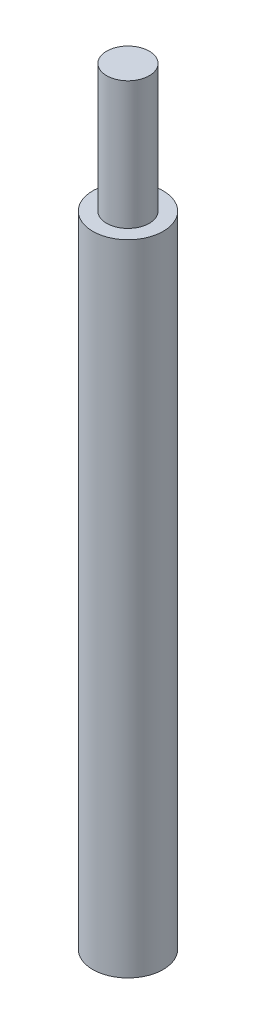
ISO-10303-21;
HEADER;
FILE_DESCRIPTION(('STEP AP214'),'2;1');
FILE_NAME('part.step','',(''),(''),'','','');
FILE_SCHEMA(('AUTOMOTIVE_DESIGN { 1 0 10303 214 1 1 1 1 }'));
ENDSEC;
DATA;
#1=APPLICATION_CONTEXT('core data for automotive mechanical design processes');
#2=APPLICATION_PROTOCOL_DEFINITION('international standard','automotive_design',2000,#1);
#3=PRODUCT_CONTEXT('',#1,'mechanical');
#4=PRODUCT('Part','Part','',(#3));
#5=PRODUCT_RELATED_PRODUCT_CATEGORY('part','',(#4));
#6=PRODUCT_DEFINITION_FORMATION('','',#4);
#7=PRODUCT_DEFINITION_CONTEXT('part definition',#1,'design');
#8=PRODUCT_DEFINITION('design','',#6,#7);
#9=PRODUCT_DEFINITION_SHAPE('','',#8);
#10=(LENGTH_UNIT() NAMED_UNIT(*) SI_UNIT(.MILLI.,.METRE.));
#11=(NAMED_UNIT(*) PLANE_ANGLE_UNIT() SI_UNIT($,.RADIAN.));
#12=(NAMED_UNIT(*) SI_UNIT($,.STERADIAN.) SOLID_ANGLE_UNIT());
#13=UNCERTAINTY_MEASURE_WITH_UNIT(LENGTH_MEASURE(1.E-05),#10,'distance_accuracy_value','');
#14=(GEOMETRIC_REPRESENTATION_CONTEXT(3) GLOBAL_UNCERTAINTY_ASSIGNED_CONTEXT((#13)) GLOBAL_UNIT_ASSIGNED_CONTEXT((#10,
#11,#12)) REPRESENTATION_CONTEXT('',''));
#15=CARTESIAN_POINT('',(0.,0.,0.));
#16=DIRECTION('',(0.,0.,1.));
#17=DIRECTION('',(1.,0.,0.));
#18=AXIS2_PLACEMENT_3D('',#15,#16,#17);
#19=CARTESIAN_POINT('',(0.,30.,0.));
#20=DIRECTION('',(0.,-1.,0.));
#21=DIRECTION('',(0.,0.,-1.));
#22=AXIS2_PLACEMENT_3D('',#19,#20,#21);
#23=CYLINDRICAL_SURFACE('',#22,1.65);
#24=CARTESIAN_POINT('',(0.,30.,0.));
#25=DIRECTION('',(0.,1.,0.));
#26=DIRECTION('',(0.,0.,1.));
#27=AXIS2_PLACEMENT_3D('',#24,#25,#26);
#28=CIRCLE('',#27,1.65);
#29=CARTESIAN_POINT('',(0.,30.,1.65));
#30=VERTEX_POINT('',#29);
#31=EDGE_CURVE('E38',#30,#30,#28,.T.);
#32=ORIENTED_EDGE('',*,*,#31,.F.);
#33=EDGE_LOOP('',(#32));
#34=FACE_BOUND('',#33,.T.);
#35=CARTESIAN_POINT('',(0.,0.,0.));
#36=DIRECTION('',(0.,1.,0.));
#37=DIRECTION('',(0.,0.,1.));
#38=AXIS2_PLACEMENT_3D('',#35,#36,#37);
#39=CIRCLE('',#38,1.65);
#40=CARTESIAN_POINT('',(0.,0.,1.65));
#41=VERTEX_POINT('',#40);
#42=EDGE_CURVE('E34',#41,#41,#39,.T.);
#43=ORIENTED_EDGE('',*,*,#42,.T.);
#44=EDGE_LOOP('',(#43));
#45=FACE_BOUND('',#44,.T.);
#46=ADVANCED_FACE('F31',(#34,#45),#23,.T.);
#47=CARTESIAN_POINT('',(0.,30.,0.));
#48=DIRECTION('',(0.,1.,0.));
#49=DIRECTION('',(0.,0.,1.));
#50=AXIS2_PLACEMENT_3D('',#47,#48,#49);
#51=PLANE('',#50);
#52=CARTESIAN_POINT('',(0.,30.,0.));
#53=DIRECTION('',(0.,1.,0.));
#54=DIRECTION('',(0.,0.,1.));
#55=AXIS2_PLACEMENT_3D('',#52,#53,#54);
#56=CIRCLE('',#55,1.);
#57=CARTESIAN_POINT('',(0.,30.,1.));
#58=VERTEX_POINT('',#57);
#59=EDGE_CURVE('E10',#58,#58,#56,.T.);
#60=ORIENTED_EDGE('',*,*,#59,.F.);
#61=EDGE_LOOP('',(#60));
#62=FACE_BOUND('',#61,.T.);
#63=ORIENTED_EDGE('',*,*,#31,.T.);
#64=EDGE_LOOP('',(#63));
#65=FACE_BOUND('',#64,.T.);
#66=ADVANCED_FACE('F55',(#62,#65),#51,.T.);
#67=CARTESIAN_POINT('',(0.,0.,0.));
#68=DIRECTION('',(0.,1.,0.));
#69=DIRECTION('',(0.,0.,1.));
#70=AXIS2_PLACEMENT_3D('',#67,#68,#69);
#71=PLANE('',#70);
#72=ORIENTED_EDGE('',*,*,#42,.F.);
#73=EDGE_LOOP('',(#72));
#74=FACE_BOUND('',#73,.T.);
#75=ADVANCED_FACE('F52',(#74),#71,.F.);
#76=CARTESIAN_POINT('',(0.,36.,0.));
#77=DIRECTION('',(0.,-1.,0.));
#78=DIRECTION('',(0.,0.,-1.));
#79=AXIS2_PLACEMENT_3D('',#76,#77,#78);
#80=CYLINDRICAL_SURFACE('',#79,1.);
#81=CARTESIAN_POINT('',(0.,36.,0.));
#82=DIRECTION('',(0.,1.,0.));
#83=DIRECTION('',(0.,0.,1.));
#84=AXIS2_PLACEMENT_3D('',#81,#82,#83);
#85=CIRCLE('',#84,1.);
#86=CARTESIAN_POINT('',(0.,36.,1.));
#87=VERTEX_POINT('',#86);
#88=EDGE_CURVE('E44',#87,#87,#85,.T.);
#89=ORIENTED_EDGE('',*,*,#88,.F.);
#90=EDGE_LOOP('',(#89));
#91=FACE_BOUND('',#90,.T.);
#92=ORIENTED_EDGE('',*,*,#59,.T.);
#93=EDGE_LOOP('',(#92));
#94=FACE_BOUND('',#93,.T.);
#95=ADVANCED_FACE('F54',(#91,#94),#80,.T.);
#96=CARTESIAN_POINT('',(0.,36.,0.));
#97=DIRECTION('',(0.,1.,0.));
#98=DIRECTION('',(0.,0.,1.));
#99=AXIS2_PLACEMENT_3D('',#96,#97,#98);
#100=PLANE('',#99);
#101=ORIENTED_EDGE('',*,*,#88,.T.);
#102=EDGE_LOOP('',(#101));
#103=FACE_BOUND('',#102,.T.);
#104=ADVANCED_FACE('F60',(#103),#100,.T.);
#105=CLOSED_SHELL('',(#46,#66,#75,#95,#104));
#106=MANIFOLD_SOLID_BREP('B2',#105);
#107=ADVANCED_BREP_SHAPE_REPRESENTATION('',(#18,#106),#14);
#108=SHAPE_DEFINITION_REPRESENTATION(#9,#107);
ENDSEC;
END-ISO-10303-21;
